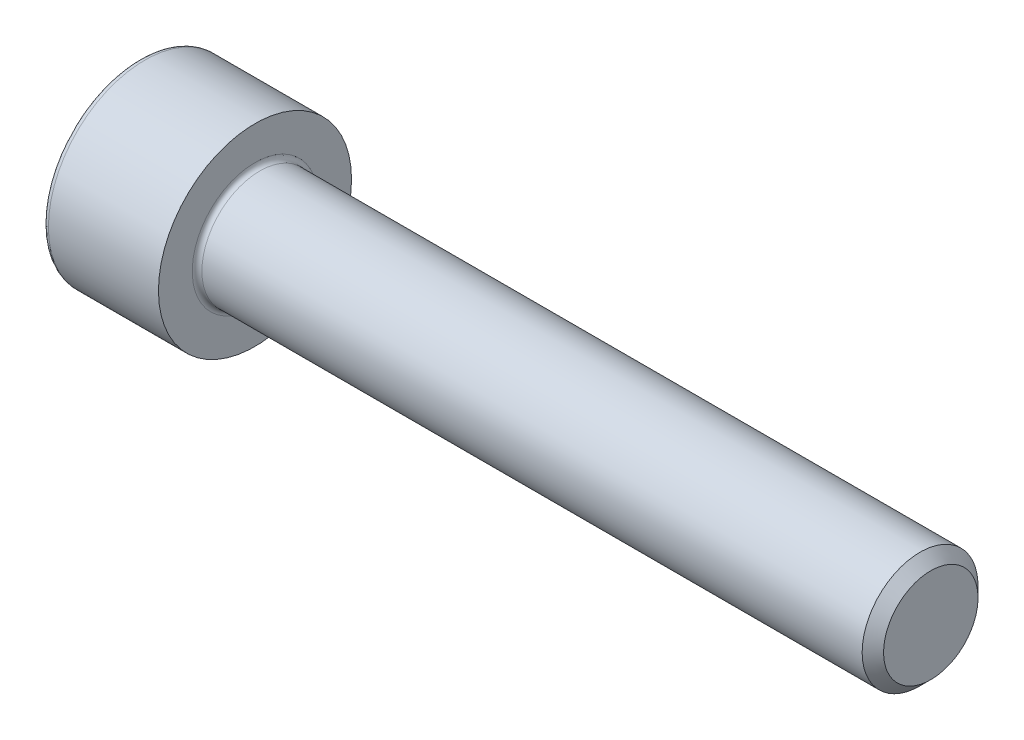
ISO-10303-21;
HEADER;
FILE_DESCRIPTION(('STEP AP214'),'2;1');
FILE_NAME('part.step','',(''),(''),'','','');
FILE_SCHEMA(('AUTOMOTIVE_DESIGN { 1 0 10303 214 1 1 1 1 }'));
ENDSEC;
DATA;
#1=APPLICATION_CONTEXT('core data for automotive mechanical design processes');
#2=APPLICATION_PROTOCOL_DEFINITION('international standard','automotive_design',2000,#1);
#3=PRODUCT_CONTEXT('',#1,'mechanical');
#4=PRODUCT('Part','Part','',(#3));
#5=PRODUCT_RELATED_PRODUCT_CATEGORY('part','',(#4));
#6=PRODUCT_DEFINITION_FORMATION('','',#4);
#7=PRODUCT_DEFINITION_CONTEXT('part definition',#1,'design');
#8=PRODUCT_DEFINITION('design','',#6,#7);
#9=PRODUCT_DEFINITION_SHAPE('','',#8);
#10=(LENGTH_UNIT() NAMED_UNIT(*) SI_UNIT(.MILLI.,.METRE.));
#11=(NAMED_UNIT(*) PLANE_ANGLE_UNIT() SI_UNIT($,.RADIAN.));
#12=(NAMED_UNIT(*) SI_UNIT($,.STERADIAN.) SOLID_ANGLE_UNIT());
#13=UNCERTAINTY_MEASURE_WITH_UNIT(LENGTH_MEASURE(1.E-05),#10,'distance_accuracy_value','');
#14=(GEOMETRIC_REPRESENTATION_CONTEXT(3) GLOBAL_UNCERTAINTY_ASSIGNED_CONTEXT((#13)) GLOBAL_UNIT_ASSIGNED_CONTEXT((#10,
#11,#12)) REPRESENTATION_CONTEXT('',''));
#15=CARTESIAN_POINT('',(0.,0.,0.));
#16=DIRECTION('',(0.,0.,1.));
#17=DIRECTION('',(1.,0.,0.));
#18=AXIS2_PLACEMENT_3D('',#15,#16,#17);
#19=CARTESIAN_POINT('',(0.,0.,0.));
#20=DIRECTION('',(-1.,0.,0.));
#21=DIRECTION('',(0.,0.,1.));
#22=AXIS2_PLACEMENT_3D('',#19,#20,#21);
#23=PLANE('',#22);
#24=DIRECTION('',(0.,-0.5,0.86602540378444));
#25=VECTOR('',#24,1.);
#26=CARTESIAN_POINT('',(0.,2.93524876856005,0.));
#27=LINE('',#26,#25);
#28=CARTESIAN_POINT('',(0.,2.93524876856005,0.));
#29=VERTEX_POINT('',#28);
#30=CARTESIAN_POINT('',(0.,1.46762438428003,2.542));
#31=VERTEX_POINT('',#30);
#32=EDGE_CURVE('E242',#29,#31,#27,.T.);
#33=ORIENTED_EDGE('',*,*,#32,.T.);
#34=DIRECTION('',(0.,1.,0.));
#35=VECTOR('',#34,1.);
#36=CARTESIAN_POINT('',(0.,-1.46762438428003,2.542));
#37=LINE('',#36,#35);
#38=CARTESIAN_POINT('',(0.,-1.46762438428003,2.542));
#39=VERTEX_POINT('',#38);
#40=EDGE_CURVE('E113',#39,#31,#37,.T.);
#41=ORIENTED_EDGE('',*,*,#40,.F.);
#42=DIRECTION('',(0.,-0.5,-0.866025403784438));
#43=VECTOR('',#42,1.);
#44=CARTESIAN_POINT('',(0.,-1.46762438428003,2.542));
#45=LINE('',#44,#43);
#46=CARTESIAN_POINT('',(0.,-2.93524876856006,0.));
#47=VERTEX_POINT('',#46);
#48=EDGE_CURVE('E245',#39,#47,#45,.T.);
#49=ORIENTED_EDGE('',*,*,#48,.T.);
#50=DIRECTION('',(0.,0.5,-0.86602540378444));
#51=VECTOR('',#50,1.);
#52=CARTESIAN_POINT('',(0.,-2.93524876856006,0.));
#53=LINE('',#52,#51);
#54=CARTESIAN_POINT('',(0.,-1.46762438428004,-2.542));
#55=VERTEX_POINT('',#54);
#56=EDGE_CURVE('E248',#47,#55,#53,.T.);
#57=ORIENTED_EDGE('',*,*,#56,.T.);
#58=DIRECTION('',(0.,-1.,0.));
#59=VECTOR('',#58,1.);
#60=CARTESIAN_POINT('',(0.,1.46762438428002,-2.542));
#61=LINE('',#60,#59);
#62=CARTESIAN_POINT('',(0.,1.46762438428002,-2.542));
#63=VERTEX_POINT('',#62);
#64=EDGE_CURVE('E251',#63,#55,#61,.T.);
#65=ORIENTED_EDGE('',*,*,#64,.F.);
#66=DIRECTION('',(0.,-0.5,-0.866025403784438));
#67=VECTOR('',#66,1.);
#68=CARTESIAN_POINT('',(0.,2.93524876856005,0.));
#69=LINE('',#68,#67);
#70=EDGE_CURVE('E108',#29,#63,#69,.T.);
#71=ORIENTED_EDGE('',*,*,#70,.F.);
#72=EDGE_LOOP('',(#33,#41,#49,#57,#65,#71));
#73=FACE_BOUND('',#72,.T.);
#74=CARTESIAN_POINT('',(0.,0.,0.));
#75=DIRECTION('',(-1.,0.,0.));
#76=DIRECTION('',(0.,0.,1.));
#77=AXIS2_PLACEMENT_3D('',#74,#75,#76);
#78=CIRCLE('',#77,4.7);
#79=CARTESIAN_POINT('',(0.,0.,4.7));
#80=VERTEX_POINT('',#79);
#81=EDGE_CURVE('E25',#80,#80,#78,.T.);
#82=ORIENTED_EDGE('',*,*,#81,.T.);
#83=EDGE_LOOP('',(#82));
#84=FACE_BOUND('',#83,.T.);
#85=ADVANCED_FACE('F17',(#73,#84),#23,.T.);
#86=CARTESIAN_POINT('',(-31.75,0.,0.));
#87=DIRECTION('',(-1.,0.,0.));
#88=DIRECTION('',(0.,0.,1.));
#89=AXIS2_PLACEMENT_3D('',#86,#87,#88);
#90=CYLINDRICAL_SURFACE('',#89,5.);
#91=CARTESIAN_POINT('',(0.3,0.,0.));
#92=DIRECTION('',(-1.,0.,0.));
#93=DIRECTION('',(0.,0.,1.));
#94=AXIS2_PLACEMENT_3D('',#91,#92,#93);
#95=CIRCLE('',#94,5.);
#96=CARTESIAN_POINT('',(0.3,0.,5.));
#97=VERTEX_POINT('',#96);
#98=EDGE_CURVE('E11',#97,#97,#95,.F.);
#99=ORIENTED_EDGE('',*,*,#98,.T.);
#100=EDGE_LOOP('',(#99));
#101=FACE_BOUND('',#100,.T.);
#102=CARTESIAN_POINT('',(6.,0.,0.));
#103=DIRECTION('',(-1.,0.,0.));
#104=DIRECTION('',(0.,0.,1.));
#105=AXIS2_PLACEMENT_3D('',#102,#103,#104);
#106=CIRCLE('',#105,5.);
#107=CARTESIAN_POINT('',(6.,0.,5.));
#108=VERTEX_POINT('',#107);
#109=EDGE_CURVE('E131',#108,#108,#106,.T.);
#110=ORIENTED_EDGE('',*,*,#109,.T.);
#111=EDGE_LOOP('',(#110));
#112=FACE_BOUND('',#111,.T.);
#113=ADVANCED_FACE('F156',(#101,#112),#90,.T.);
#114=CARTESIAN_POINT('',(6.,5.,0.));
#115=DIRECTION('',(1.,0.,0.));
#116=DIRECTION('',(0.,0.,-1.));
#117=AXIS2_PLACEMENT_3D('',#114,#115,#116);
#118=PLANE('',#117);
#119=CARTESIAN_POINT('',(6.,0.,0.));
#120=DIRECTION('',(1.,0.,0.));
#121=DIRECTION('',(0.,0.,-1.));
#122=AXIS2_PLACEMENT_3D('',#119,#120,#121);
#123=CIRCLE('',#122,3.25);
#124=CARTESIAN_POINT('',(6.,0.,-3.25));
#125=VERTEX_POINT('',#124);
#126=EDGE_CURVE('E134',#125,#125,#123,.F.);
#127=ORIENTED_EDGE('',*,*,#126,.T.);
#128=EDGE_LOOP('',(#127));
#129=FACE_BOUND('',#128,.T.);
#130=ORIENTED_EDGE('',*,*,#109,.F.);
#131=EDGE_LOOP('',(#130));
#132=FACE_BOUND('',#131,.T.);
#133=ADVANCED_FACE('F162',(#129,#132),#118,.T.);
#134=CARTESIAN_POINT('',(-31.75,0.,0.));
#135=DIRECTION('',(-1.,0.,0.));
#136=DIRECTION('',(0.,0.,1.));
#137=AXIS2_PLACEMENT_3D('',#134,#135,#136);
#138=CYLINDRICAL_SURFACE('',#137,3.);
#139=CARTESIAN_POINT('',(6.25,0.,0.));
#140=DIRECTION('',(1.,0.,0.));
#141=DIRECTION('',(0.,0.,-1.));
#142=AXIS2_PLACEMENT_3D('',#139,#140,#141);
#143=CIRCLE('',#142,3.);
#144=CARTESIAN_POINT('',(6.25,0.,-3.));
#145=VERTEX_POINT('',#144);
#146=EDGE_CURVE('E137',#145,#145,#143,.T.);
#147=ORIENTED_EDGE('',*,*,#146,.T.);
#148=EDGE_LOOP('',(#147));
#149=FACE_BOUND('',#148,.T.);
#150=CARTESIAN_POINT('',(40.4455,0.,0.));
#151=DIRECTION('',(-1.,0.,0.));
#152=DIRECTION('',(0.,0.,1.));
#153=AXIS2_PLACEMENT_3D('',#150,#151,#152);
#154=CIRCLE('',#153,2.99999999999996);
#155=CARTESIAN_POINT('',(40.4455,0.,2.99999999999996));
#156=VERTEX_POINT('',#155);
#157=EDGE_CURVE('E128',#156,#156,#154,.T.);
#158=ORIENTED_EDGE('',*,*,#157,.T.);
#159=EDGE_LOOP('',(#158));
#160=FACE_BOUND('',#159,.T.);
#161=ADVANCED_FACE('F168',(#149,#160),#138,.T.);
#162=CARTESIAN_POINT('',(41.,0.,0.));
#163=DIRECTION('',(-1.,0.,0.));
#164=DIRECTION('',(0.,0.,1.));
#165=AXIS2_PLACEMENT_3D('',#162,#163,#164);
#166=CONICAL_SURFACE('',#165,2.4455,0.785398163397396);
#167=ORIENTED_EDGE('',*,*,#157,.F.);
#168=EDGE_LOOP('',(#167));
#169=FACE_BOUND('',#168,.T.);
#170=CARTESIAN_POINT('',(41.,0.,0.));
#171=DIRECTION('',(-1.,0.,0.));
#172=DIRECTION('',(0.,0.,1.));
#173=AXIS2_PLACEMENT_3D('',#170,#171,#172);
#174=CIRCLE('',#173,2.4455);
#175=CARTESIAN_POINT('',(41.,0.,2.4455));
#176=VERTEX_POINT('',#175);
#177=EDGE_CURVE('E124',#176,#176,#174,.T.);
#178=ORIENTED_EDGE('',*,*,#177,.T.);
#179=EDGE_LOOP('',(#178));
#180=FACE_BOUND('',#179,.T.);
#181=ADVANCED_FACE('F172',(#169,#180),#166,.T.);
#182=CARTESIAN_POINT('',(41.,2.4455,0.));
#183=DIRECTION('',(1.,0.,0.));
#184=DIRECTION('',(0.,0.,-1.));
#185=AXIS2_PLACEMENT_3D('',#182,#183,#184);
#186=PLANE('',#185);
#187=ORIENTED_EDGE('',*,*,#177,.F.);
#188=EDGE_LOOP('',(#187));
#189=FACE_BOUND('',#188,.T.);
#190=ADVANCED_FACE('F152',(#189),#186,.T.);
#191=CARTESIAN_POINT('',(6.25,0.,0.));
#192=DIRECTION('',(1.,0.,0.));
#193=DIRECTION('',(0.,0.,-1.));
#194=AXIS2_PLACEMENT_3D('',#191,#192,#193);
#195=TOROIDAL_SURFACE('',#194,3.25,0.25);
#196=ORIENTED_EDGE('',*,*,#146,.F.);
#197=EDGE_LOOP('',(#196));
#198=FACE_BOUND('',#197,.T.);
#199=ORIENTED_EDGE('',*,*,#126,.F.);
#200=EDGE_LOOP('',(#199));
#201=FACE_BOUND('',#200,.T.);
#202=ADVANCED_FACE('F144',(#198,#201),#195,.F.);
#203=CARTESIAN_POINT('',(0.3,0.,0.));
#204=DIRECTION('',(-1.,0.,0.));
#205=DIRECTION('',(0.,0.,1.));
#206=AXIS2_PLACEMENT_3D('',#203,#204,#205);
#207=TOROIDAL_SURFACE('',#206,4.7,0.3);
#208=ORIENTED_EDGE('',*,*,#98,.F.);
#209=EDGE_LOOP('',(#208));
#210=FACE_BOUND('',#209,.T.);
#211=ORIENTED_EDGE('',*,*,#81,.F.);
#212=EDGE_LOOP('',(#211));
#213=FACE_BOUND('',#212,.T.);
#214=ADVANCED_FACE('F19',(#210,#213),#207,.T.);
#215=CARTESIAN_POINT('',(3.,2.93524876856005,0.));
#216=DIRECTION('',(0.,-0.866025403784439,-0.5));
#217=DIRECTION('',(0.,0.5,-0.86602540378444));
#218=AXIS2_PLACEMENT_3D('',#215,#216,#217);
#219=PLANE('',#218);
#220=ORIENTED_EDGE('',*,*,#32,.F.);
#221=DIRECTION('',(-1.,0.,0.));
#222=VECTOR('',#221,1.);
#223=CARTESIAN_POINT('',(3.,2.93524876856005,0.));
#224=LINE('',#223,#222);
#225=CARTESIAN_POINT('',(3.,2.93524876856005,0.));
#226=VERTEX_POINT('',#225);
#227=EDGE_CURVE('E232',#226,#29,#224,.T.);
#228=ORIENTED_EDGE('',*,*,#227,.F.);
#229=DIRECTION('',(0.,-0.5,0.86602540378444));
#230=VECTOR('',#229,1.);
#231=CARTESIAN_POINT('',(3.,2.93524876856005,0.));
#232=LINE('',#231,#230);
#233=CARTESIAN_POINT('',(3.,2.20143657642004,1.271));
#234=VERTEX_POINT('',#233);
#235=EDGE_CURVE('E100',#226,#234,#232,.T.);
#236=ORIENTED_EDGE('',*,*,#235,.T.);
#237=CARTESIAN_POINT('',(3.,1.46762438428003,2.542));
#238=VERTEX_POINT('',#237);
#239=EDGE_CURVE('E91',#234,#238,#232,.T.);
#240=ORIENTED_EDGE('',*,*,#239,.T.);
#241=DIRECTION('',(-1.,0.,0.));
#242=VECTOR('',#241,1.);
#243=CARTESIAN_POINT('',(3.,1.46762438428003,2.542));
#244=LINE('',#243,#242);
#245=EDGE_CURVE('E105',#238,#31,#244,.T.);
#246=ORIENTED_EDGE('',*,*,#245,.T.);
#247=EDGE_LOOP('',(#220,#228,#236,#240,#246));
#248=FACE_BOUND('',#247,.T.);
#249=ADVANCED_FACE('F104',(#248),#219,.T.);
#250=CARTESIAN_POINT('',(3.,-1.46762438428003,2.542));
#251=DIRECTION('',(0.,0.,1.));
#252=DIRECTION('',(0.,-1.,0.));
#253=AXIS2_PLACEMENT_3D('',#250,#251,#252);
#254=PLANE('',#253);
#255=ORIENTED_EDGE('',*,*,#40,.T.);
#256=ORIENTED_EDGE('',*,*,#245,.F.);
#257=DIRECTION('',(0.,1.,0.));
#258=VECTOR('',#257,1.);
#259=CARTESIAN_POINT('',(3.,-1.46762438428003,2.542));
#260=LINE('',#259,#258);
#261=CARTESIAN_POINT('',(3.,0.,2.542));
#262=VERTEX_POINT('',#261);
#263=EDGE_CURVE('E88',#262,#238,#260,.T.);
#264=ORIENTED_EDGE('',*,*,#263,.F.);
#265=CARTESIAN_POINT('',(3.,-1.46762438428003,2.542));
#266=VERTEX_POINT('',#265);
#267=EDGE_CURVE('E99',#266,#262,#260,.T.);
#268=ORIENTED_EDGE('',*,*,#267,.F.);
#269=DIRECTION('',(-1.,0.,0.));
#270=VECTOR('',#269,1.);
#271=CARTESIAN_POINT('',(3.,-1.46762438428003,2.542));
#272=LINE('',#271,#270);
#273=EDGE_CURVE('E115',#266,#39,#272,.T.);
#274=ORIENTED_EDGE('',*,*,#273,.T.);
#275=EDGE_LOOP('',(#255,#256,#264,#268,#274));
#276=FACE_BOUND('',#275,.T.);
#277=ADVANCED_FACE('F110',(#276),#254,.F.);
#278=CARTESIAN_POINT('',(3.,-1.46762438428003,2.542));
#279=DIRECTION('',(0.,0.866025403784438,-0.5));
#280=DIRECTION('',(0.,0.5,0.866025403784438));
#281=AXIS2_PLACEMENT_3D('',#278,#279,#280);
#282=PLANE('',#281);
#283=ORIENTED_EDGE('',*,*,#48,.F.);
#284=ORIENTED_EDGE('',*,*,#273,.F.);
#285=DIRECTION('',(0.,-0.5,-0.866025403784438));
#286=VECTOR('',#285,1.);
#287=CARTESIAN_POINT('',(3.,-1.46762438428003,2.542));
#288=LINE('',#287,#286);
#289=CARTESIAN_POINT('',(3.,-2.20143657642005,1.271));
#290=VERTEX_POINT('',#289);
#291=EDGE_CURVE('E271',#266,#290,#288,.T.);
#292=ORIENTED_EDGE('',*,*,#291,.T.);
#293=CARTESIAN_POINT('',(3.,-2.93524876856006,0.));
#294=VERTEX_POINT('',#293);
#295=EDGE_CURVE('E260',#290,#294,#288,.T.);
#296=ORIENTED_EDGE('',*,*,#295,.T.);
#297=DIRECTION('',(-1.,0.,0.));
#298=VECTOR('',#297,1.);
#299=CARTESIAN_POINT('',(3.,-2.93524876856006,0.));
#300=LINE('',#299,#298);
#301=EDGE_CURVE('E120',#294,#47,#300,.T.);
#302=ORIENTED_EDGE('',*,*,#301,.T.);
#303=EDGE_LOOP('',(#283,#284,#292,#296,#302));
#304=FACE_BOUND('',#303,.T.);
#305=ADVANCED_FACE('F186',(#304),#282,.T.);
#306=CARTESIAN_POINT('',(3.,-2.93524876856006,0.));
#307=DIRECTION('',(0.,0.86602540378444,0.5));
#308=DIRECTION('',(0.,-0.5,0.86602540378444));
#309=AXIS2_PLACEMENT_3D('',#306,#307,#308);
#310=PLANE('',#309);
#311=ORIENTED_EDGE('',*,*,#56,.F.);
#312=ORIENTED_EDGE('',*,*,#301,.F.);
#313=DIRECTION('',(0.,0.5,-0.86602540378444));
#314=VECTOR('',#313,1.);
#315=CARTESIAN_POINT('',(3.,-2.93524876856006,0.));
#316=LINE('',#315,#314);
#317=CARTESIAN_POINT('',(3.,-2.20143657642005,-1.271));
#318=VERTEX_POINT('',#317);
#319=EDGE_CURVE('E238',#294,#318,#316,.T.);
#320=ORIENTED_EDGE('',*,*,#319,.T.);
#321=CARTESIAN_POINT('',(3.,-1.46762438428004,-2.542));
#322=VERTEX_POINT('',#321);
#323=EDGE_CURVE('E270',#318,#322,#316,.T.);
#324=ORIENTED_EDGE('',*,*,#323,.T.);
#325=DIRECTION('',(-1.,0.,0.));
#326=VECTOR('',#325,1.);
#327=CARTESIAN_POINT('',(3.,-1.46762438428004,-2.542));
#328=LINE('',#327,#326);
#329=EDGE_CURVE('E231',#322,#55,#328,.T.);
#330=ORIENTED_EDGE('',*,*,#329,.T.);
#331=EDGE_LOOP('',(#311,#312,#320,#324,#330));
#332=FACE_BOUND('',#331,.T.);
#333=ADVANCED_FACE('F189',(#332),#310,.T.);
#334=CARTESIAN_POINT('',(3.,1.46762438428002,-2.542));
#335=DIRECTION('',(0.,0.,-1.));
#336=DIRECTION('',(0.,1.,0.));
#337=AXIS2_PLACEMENT_3D('',#334,#335,#336);
#338=PLANE('',#337);
#339=ORIENTED_EDGE('',*,*,#64,.T.);
#340=ORIENTED_EDGE('',*,*,#329,.F.);
#341=DIRECTION('',(0.,-1.,0.));
#342=VECTOR('',#341,1.);
#343=CARTESIAN_POINT('',(3.,1.46762438428002,-2.542));
#344=LINE('',#343,#342);
#345=CARTESIAN_POINT('',(3.,0.,-2.542));
#346=VERTEX_POINT('',#345);
#347=EDGE_CURVE('E235',#346,#322,#344,.T.);
#348=ORIENTED_EDGE('',*,*,#347,.F.);
#349=CARTESIAN_POINT('',(3.,1.46762438428002,-2.542));
#350=VERTEX_POINT('',#349);
#351=EDGE_CURVE('E32',#350,#346,#344,.T.);
#352=ORIENTED_EDGE('',*,*,#351,.F.);
#353=DIRECTION('',(-1.,0.,0.));
#354=VECTOR('',#353,1.);
#355=CARTESIAN_POINT('',(3.,1.46762438428002,-2.542));
#356=LINE('',#355,#354);
#357=EDGE_CURVE('E228',#350,#63,#356,.T.);
#358=ORIENTED_EDGE('',*,*,#357,.T.);
#359=EDGE_LOOP('',(#339,#340,#348,#352,#358));
#360=FACE_BOUND('',#359,.T.);
#361=ADVANCED_FACE('F193',(#360),#338,.F.);
#362=CARTESIAN_POINT('',(3.,2.93524876856005,0.));
#363=DIRECTION('',(0.,0.866025403784438,-0.5));
#364=DIRECTION('',(0.,0.5,0.866025403784438));
#365=AXIS2_PLACEMENT_3D('',#362,#363,#364);
#366=PLANE('',#365);
#367=ORIENTED_EDGE('',*,*,#70,.T.);
#368=ORIENTED_EDGE('',*,*,#357,.F.);
#369=DIRECTION('',(0.,-0.5,-0.866025403784438));
#370=VECTOR('',#369,1.);
#371=CARTESIAN_POINT('',(3.,2.93524876856005,0.));
#372=LINE('',#371,#370);
#373=CARTESIAN_POINT('',(3.,2.20143657642003,-1.271));
#374=VERTEX_POINT('',#373);
#375=EDGE_CURVE('E218',#374,#350,#372,.T.);
#376=ORIENTED_EDGE('',*,*,#375,.F.);
#377=EDGE_CURVE('E224',#226,#374,#372,.T.);
#378=ORIENTED_EDGE('',*,*,#377,.F.);
#379=ORIENTED_EDGE('',*,*,#227,.T.);
#380=EDGE_LOOP('',(#367,#368,#376,#378,#379));
#381=FACE_BOUND('',#380,.T.);
#382=ADVANCED_FACE('F197',(#381),#366,.F.);
#383=CARTESIAN_POINT('',(3.,4.40287315284008,-2.542));
#384=DIRECTION('',(1.,0.,0.));
#385=DIRECTION('',(0.,0.,-1.));
#386=AXIS2_PLACEMENT_3D('',#383,#384,#385);
#387=PLANE('',#386);
#388=ORIENTED_EDGE('',*,*,#347,.T.);
#389=ORIENTED_EDGE('',*,*,#323,.F.);
#390=CARTESIAN_POINT('',(3.,0.,0.));
#391=DIRECTION('',(-1.,0.,0.));
#392=DIRECTION('',(0.,0.,1.));
#393=AXIS2_PLACEMENT_3D('',#390,#391,#392);
#394=CIRCLE('',#393,2.542);
#395=EDGE_CURVE('E266',#346,#318,#394,.T.);
#396=ORIENTED_EDGE('',*,*,#395,.F.);
#397=EDGE_LOOP('',(#388,#389,#396));
#398=FACE_BOUND('',#397,.T.);
#399=ADVANCED_FACE('F201',(#398),#387,.F.);
#400=ORIENTED_EDGE('',*,*,#319,.F.);
#401=ORIENTED_EDGE('',*,*,#295,.F.);
#402=EDGE_CURVE('E118',#318,#290,#394,.T.);
#403=ORIENTED_EDGE('',*,*,#402,.F.);
#404=EDGE_LOOP('',(#400,#401,#403));
#405=FACE_BOUND('',#404,.T.);
#406=ADVANCED_FACE('F204',(#405),#387,.F.);
#407=ORIENTED_EDGE('',*,*,#291,.F.);
#408=ORIENTED_EDGE('',*,*,#267,.T.);
#409=EDGE_CURVE('E114',#290,#262,#394,.T.);
#410=ORIENTED_EDGE('',*,*,#409,.F.);
#411=EDGE_LOOP('',(#407,#408,#410));
#412=FACE_BOUND('',#411,.T.);
#413=ADVANCED_FACE('F209',(#412),#387,.F.);
#414=ORIENTED_EDGE('',*,*,#263,.T.);
#415=ORIENTED_EDGE('',*,*,#239,.F.);
#416=EDGE_CURVE('E94',#262,#234,#394,.T.);
#417=ORIENTED_EDGE('',*,*,#416,.F.);
#418=EDGE_LOOP('',(#414,#415,#417));
#419=FACE_BOUND('',#418,.T.);
#420=ADVANCED_FACE('F90',(#419),#387,.F.);
#421=ORIENTED_EDGE('',*,*,#235,.F.);
#422=ORIENTED_EDGE('',*,*,#377,.T.);
#423=EDGE_CURVE('E125',#234,#374,#394,.T.);
#424=ORIENTED_EDGE('',*,*,#423,.F.);
#425=EDGE_LOOP('',(#421,#422,#424));
#426=FACE_BOUND('',#425,.T.);
#427=ADVANCED_FACE('F212',(#426),#387,.F.);
#428=ORIENTED_EDGE('',*,*,#375,.T.);
#429=ORIENTED_EDGE('',*,*,#351,.T.);
#430=EDGE_CURVE('E221',#374,#346,#394,.T.);
#431=ORIENTED_EDGE('',*,*,#430,.F.);
#432=EDGE_LOOP('',(#428,#429,#431));
#433=FACE_BOUND('',#432,.T.);
#434=ADVANCED_FACE('F182',(#433),#387,.F.);
#435=CARTESIAN_POINT('',(3.,0.,0.));
#436=DIRECTION('',(-1.,0.,0.));
#437=DIRECTION('',(0.,0.,1.));
#438=AXIS2_PLACEMENT_3D('',#435,#436,#437);
#439=CONICAL_SURFACE('',#438,2.542,1.0471975511966);
#440=CARTESIAN_POINT('',(4.46762438428005,0.,0.));
#441=VERTEX_POINT('',#440);
#442=VERTEX_LOOP('',#441);
#443=FACE_BOUND('',#442,.T.);
#444=ORIENTED_EDGE('',*,*,#416,.T.);
#445=ORIENTED_EDGE('',*,*,#423,.T.);
#446=ORIENTED_EDGE('',*,*,#430,.T.);
#447=ORIENTED_EDGE('',*,*,#395,.T.);
#448=ORIENTED_EDGE('',*,*,#402,.T.);
#449=ORIENTED_EDGE('',*,*,#409,.T.);
#450=EDGE_LOOP('',(#444,#445,#446,#447,#448,#449));
#451=FACE_BOUND('',#450,.T.);
#452=ADVANCED_FACE('F180',(#443,#451),#439,.F.);
#453=CLOSED_SHELL('',(#85,#113,#133,#161,#181,#190,#202,#214,#249,#277,#305,#333,#361,#382,#399,
#406,#413,#420,#427,#434,#452));
#454=MANIFOLD_SOLID_BREP('B1',#453);
#455=ADVANCED_BREP_SHAPE_REPRESENTATION('',(#18,#454),#14);
#456=SHAPE_DEFINITION_REPRESENTATION(#9,#455);
ENDSEC;
END-ISO-10303-21;
